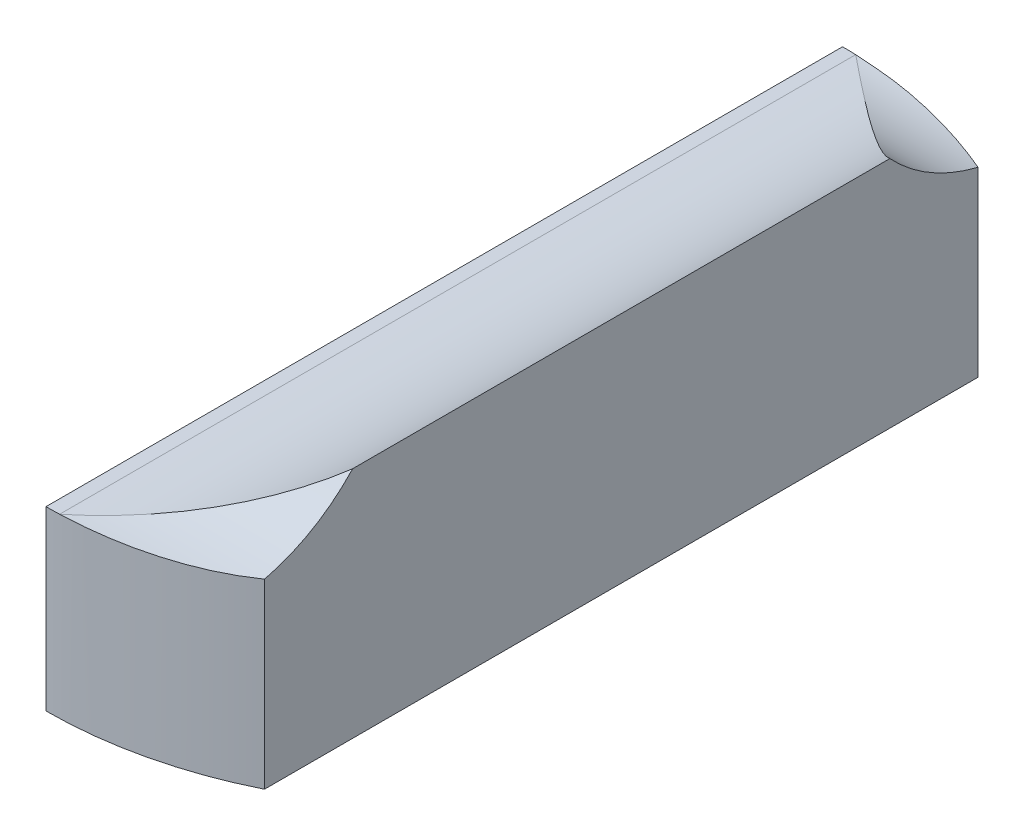
ISO-10303-21;
HEADER;
FILE_DESCRIPTION(('STEP AP214'),'2;1');
FILE_NAME('part.step','',(''),(''),'','','');
FILE_SCHEMA(('AUTOMOTIVE_DESIGN { 1 0 10303 214 1 1 1 1 }'));
ENDSEC;
DATA;
#1=APPLICATION_CONTEXT('core data for automotive mechanical design processes');
#2=APPLICATION_PROTOCOL_DEFINITION('international standard','automotive_design',2000,#1);
#3=PRODUCT_CONTEXT('',#1,'mechanical');
#4=PRODUCT('Part','Part','',(#3));
#5=PRODUCT_RELATED_PRODUCT_CATEGORY('part','',(#4));
#6=PRODUCT_DEFINITION_FORMATION('','',#4);
#7=PRODUCT_DEFINITION_CONTEXT('part definition',#1,'design');
#8=PRODUCT_DEFINITION('design','',#6,#7);
#9=PRODUCT_DEFINITION_SHAPE('','',#8);
#10=(LENGTH_UNIT() NAMED_UNIT(*) SI_UNIT(.MILLI.,.METRE.));
#11=(NAMED_UNIT(*) PLANE_ANGLE_UNIT() SI_UNIT($,.RADIAN.));
#12=(NAMED_UNIT(*) SI_UNIT($,.STERADIAN.) SOLID_ANGLE_UNIT());
#13=UNCERTAINTY_MEASURE_WITH_UNIT(LENGTH_MEASURE(1.E-05),#10,'distance_accuracy_value','');
#14=(GEOMETRIC_REPRESENTATION_CONTEXT(3) GLOBAL_UNCERTAINTY_ASSIGNED_CONTEXT((#13)) GLOBAL_UNIT_ASSIGNED_CONTEXT((#10,
#11,#12)) REPRESENTATION_CONTEXT('',''));
#15=CARTESIAN_POINT('',(0.,0.,0.));
#16=DIRECTION('',(0.,0.,1.));
#17=DIRECTION('',(1.,0.,0.));
#18=AXIS2_PLACEMENT_3D('',#15,#16,#17);
#19=CARTESIAN_POINT('',(0.,0.,0.));
#20=DIRECTION('',(0.,1.,0.));
#21=DIRECTION('',(1.,0.,0.));
#22=AXIS2_PLACEMENT_3D('',#19,#20,#21);
#23=CYLINDRICAL_SURFACE('',#22,28.575);
#24=DIRECTION('',(0.,1.,0.));
#25=VECTOR('',#24,1.);
#26=CARTESIAN_POINT('',(12.7,0.,25.5976683508479));
#27=LINE('',#26,#25);
#28=CARTESIAN_POINT('',(12.7,13.0539279019213,25.5976683508479));
#29=VERTEX_POINT('',#28);
#30=CARTESIAN_POINT('',(12.7,0.,25.5976683508479));
#31=VERTEX_POINT('',#30);
#32=EDGE_CURVE('E109',#29,#31,#27,.F.);
#33=ORIENTED_EDGE('',*,*,#32,.F.);
#34=CARTESIAN_POINT('',(0.962642906827022,12.700010357177,28.5587804997681));
#35=CARTESIAN_POINT('',(1.36077615471735,12.7000623405138,28.5453656936281));
#36=CARTESIAN_POINT('',(1.75862826128871,12.7000777129775,28.523615158628));
#37=CARTESIAN_POINT('',(2.55307900061478,12.7004445435274,28.4635033900954));
#38=CARTESIAN_POINT('',(2.9496776222913,12.7007960045757,28.4251420101689));
#39=CARTESIAN_POINT('',(3.74118367355271,12.7022448100345,28.3318388399094));
#40=CARTESIAN_POINT('',(4.13608981752724,12.7033426454521,28.2768861481122));
#41=CARTESIAN_POINT('',(4.92324947877102,12.7069381444701,28.1505085420081));
#42=CARTESIAN_POINT('',(5.3155030100975,12.7094358006464,28.0790837150642));
#43=CARTESIAN_POINT('',(6.09971504540883,12.7166858056776,27.9192672109259));
#44=CARTESIAN_POINT('',(6.4916472676977,12.7214556291278,27.8307472519799));
#45=CARTESIAN_POINT('',(7.27137942149177,12.7342954373665,27.6372759357328));
#46=CARTESIAN_POINT('',(7.65917937835118,12.7423654018945,27.5323246793108));
#47=CARTESIAN_POINT('',(8.42975641138034,12.7630247665727,27.3062442771493));
#48=CARTESIAN_POINT('',(8.8125354073083,12.775612383907,27.1851215250436));
#49=CARTESIAN_POINT('',(9.57240197152831,12.8067151020722,26.926952705874));
#50=CARTESIAN_POINT('',(9.94948991381911,12.8252298116008,26.7899076903666));
#51=CARTESIAN_POINT('',(10.8728927614276,12.88022897177,26.4321390510183));
#52=CARTESIAN_POINT('',(11.4154826589438,12.9210691874319,26.2023506985232));
#53=CARTESIAN_POINT('',(12.4837500300381,13.024700133787,25.7105492096721));
#54=CARTESIAN_POINT('',(13.0094275076119,13.0874908592944,25.4485360809295));
#55=CARTESIAN_POINT('',(14.0386470887018,13.2413188739397,24.8955218155012));
#56=CARTESIAN_POINT('',(14.5422624233341,13.332253103732,24.6046290316585));
#57=CARTESIAN_POINT('',(15.5253033043412,13.5496409178739,23.9964408281848));
#58=CARTESIAN_POINT('',(16.0047377492519,13.6760813218248,23.6791552366417));
#59=CARTESIAN_POINT('',(16.800254791929,13.9292795846889,23.1180863947747));
#60=CARTESIAN_POINT('',(17.123479173042,14.0453697569777,22.8795842085311));
#61=CARTESIAN_POINT('',(17.7534814150312,14.3020869374188,22.3942506215131));
#62=CARTESIAN_POINT('',(18.0602635179013,14.442707576658,22.1474213960954));
#63=CARTESIAN_POINT('',(18.6552298779792,14.75098919158,21.6486405813578));
#64=CARTESIAN_POINT('',(18.9434257676909,14.9186330198069,21.39669232832));
#65=CARTESIAN_POINT('',(19.4993082033762,15.2832535278009,20.8913521389599));
#66=CARTESIAN_POINT('',(19.7669984562148,15.4802248869015,20.6379604725079));
#67=CARTESIAN_POINT('',(20.2341271811735,15.8672649280327,20.1791498346762));
#68=CARTESIAN_POINT('',(20.4372307469284,16.0523162472183,19.9732236591284));
#69=CARTESIAN_POINT('',(20.8271119044121,16.4437967724493,19.5663328075717));
#70=CARTESIAN_POINT('',(21.0138928933059,16.6502215104805,19.3653671054332));
#71=CARTESIAN_POINT('',(21.3701713398591,17.0844581875766,18.9714767796639));
#72=CARTESIAN_POINT('',(21.5396731307898,17.3122647368571,18.778550147209));
#73=CARTESIAN_POINT('',(21.8606787701723,17.7888329775473,18.4038644446777));
#74=CARTESIAN_POINT('',(22.0121823840227,18.0375949420331,18.2221055201843));
#75=CARTESIAN_POINT('',(22.2974382732527,18.5565357068221,17.8719385757042));
#76=CARTESIAN_POINT('',(22.4310835821065,18.8268293218901,17.7036132435075));
#77=CARTESIAN_POINT('',(22.6792372799584,19.38600360836,17.3845820896443));
#78=CARTESIAN_POINT('',(22.7937450751443,19.674884856127,17.2338768147488));
#79=CARTESIAN_POINT('',(23.0034597029794,20.2691361993014,16.9529413248224));
#80=CARTESIAN_POINT('',(23.0986674152611,20.5745055424336,16.822710176711));
#81=CARTESIAN_POINT('',(23.2697906029362,21.1992400095342,16.5852020750128));
#82=CARTESIAN_POINT('',(23.3457083799338,21.518603458441,16.4779223831843));
#83=CARTESIAN_POINT('',(23.4701116512248,22.1280288875913,16.3001450747159));
#84=CARTESIAN_POINT('',(23.5208356826167,22.4167889086254,16.2267309961218));
#85=CARTESIAN_POINT('',(23.6076984469343,23.0008228755959,16.100096420655));
#86=CARTESIAN_POINT('',(23.6438389598952,23.2960960219103,16.0468734593424));
#87=CARTESIAN_POINT('',(23.7016972573092,23.8916760012838,15.9612926922762));
#88=CARTESIAN_POINT('',(23.7233869803638,24.1919914737936,15.9289754860677));
#89=CARTESIAN_POINT('',(23.7450719580584,24.6440955572715,15.8966136679713));
#90=CARTESIAN_POINT('',(23.7504920138431,24.795104241373,15.8885120518039));
#91=CARTESIAN_POINT('',(23.7577175691802,25.0974022832643,15.8777046290734));
#92=CARTESIAN_POINT('',(23.7595230358135,25.2486916435978,15.8749988716518));
#93=CARTESIAN_POINT('',(23.7595244060145,25.4,15.875));
#94=B_SPLINE_CURVE_WITH_KNOTS('',3,(#34,#35,#36,#37,#38,#39,#40,#41,#42,#43,#44,#45,#46,#47,#48,
#49,#50,#51,#52,#53,#54,#55,#56,#57,#58,#59,#60,#61,#62,#63,#64,#65,#66,#67,#68,#69,#70,#71,#72,
#73,#74,#75,#76,#77,#78,#79,#80,#81,#82,#83,#84,#85,#86,#87,#88,#89,#90,#91,#92,#93),
.UNSPECIFIED.,.F.,.F.,(4,2,2,2,2,2,2,2,2,2,2,2,2,2,2,2,2,2,2,2,2,2,2,2,2,2,2,2,2,4),(0.,
1.19499017098555,2.38999087382109,3.58577847726653,4.78155973878477,5.98668965456981,
7.19181217181565,8.39645962969053,9.60102757401706,11.3715014476631,13.1419749030226,
14.9060402345202,16.6694515834793,17.9228644895058,19.1759524514992,20.4282483792196,
21.6803173888097,22.709415177226,23.7382982701966,24.7669227021674,25.7955605405169,
26.830107096135,27.8646857464337,28.8992172335378,29.9336252261262,30.8392539807823,
31.7447721627436,32.6520436478983,33.1058917422523,33.5597439699006),.UNSPECIFIED.);
#95=CARTESIAN_POINT('',(0.962642846214586,12.7000054003863,28.5587786952444));
#96=VERTEX_POINT('',#95);
#97=EDGE_CURVE('E118',#96,#29,#94,.T.);
#98=ORIENTED_EDGE('',*,*,#97,.F.);
#99=CARTESIAN_POINT('',(0.,12.7,0.));
#100=DIRECTION('',(0.,1.,0.));
#101=DIRECTION('',(0.,0.,1.));
#102=AXIS2_PLACEMENT_3D('',#99,#100,#101);
#103=CIRCLE('',#102,28.575);
#104=CARTESIAN_POINT('',(0.,12.7,28.575));
#105=VERTEX_POINT('',#104);
#106=EDGE_CURVE('E130',#105,#96,#103,.T.);
#107=ORIENTED_EDGE('',*,*,#106,.F.);
#108=DIRECTION('',(0.,1.,0.));
#109=VECTOR('',#108,1.);
#110=CARTESIAN_POINT('',(0.,0.,28.575));
#111=LINE('',#110,#109);
#112=CARTESIAN_POINT('',(0.,0.,28.575));
#113=VERTEX_POINT('',#112);
#114=EDGE_CURVE('E314',#105,#113,#111,.F.);
#115=ORIENTED_EDGE('',*,*,#114,.T.);
#116=CARTESIAN_POINT('',(0.,0.,0.));
#117=DIRECTION('',(0.,1.,0.));
#118=DIRECTION('',(0.,0.,1.));
#119=AXIS2_PLACEMENT_3D('',#116,#117,#118);
#120=CIRCLE('',#119,28.575);
#121=EDGE_CURVE('E122',#113,#31,#120,.T.);
#122=ORIENTED_EDGE('',*,*,#121,.T.);
#123=EDGE_LOOP('',(#33,#98,#107,#115,#122));
#124=FACE_BOUND('',#123,.T.);
#125=ADVANCED_FACE('F52',(#124),#23,.T.);
#126=DIRECTION('',(0.,1.,0.));
#127=VECTOR('',#126,1.);
#128=CARTESIAN_POINT('',(12.7,0.,-25.5976683508479));
#129=LINE('',#128,#127);
#130=CARTESIAN_POINT('',(12.7,0.,-25.5976683508479));
#131=VERTEX_POINT('',#130);
#132=CARTESIAN_POINT('',(12.7000000000208,13.0539439966948,-25.597729758866));
#133=VERTEX_POINT('',#132);
#134=EDGE_CURVE('E315',#131,#133,#129,.T.);
#135=ORIENTED_EDGE('',*,*,#134,.F.);
#136=CARTESIAN_POINT('',(0.,0.,-28.575));
#137=VERTEX_POINT('',#136);
#138=EDGE_CURVE('E78',#131,#137,#120,.T.);
#139=ORIENTED_EDGE('',*,*,#138,.T.);
#140=DIRECTION('',(0.,1.,0.));
#141=VECTOR('',#140,1.);
#142=CARTESIAN_POINT('',(0.,0.,-28.575));
#143=LINE('',#142,#141);
#144=CARTESIAN_POINT('',(0.,12.7,-28.575));
#145=VERTEX_POINT('',#144);
#146=EDGE_CURVE('E311',#137,#145,#143,.T.);
#147=ORIENTED_EDGE('',*,*,#146,.T.);
#148=CARTESIAN_POINT('',(0.,12.7,0.));
#149=DIRECTION('',(0.,1.,0.));
#150=DIRECTION('',(0.,0.,1.));
#151=AXIS2_PLACEMENT_3D('',#148,#149,#150);
#152=CIRCLE('',#151,28.575);
#153=CARTESIAN_POINT('',(0.962642841908872,12.7000054003817,-28.5587786987607));
#154=VERTEX_POINT('',#153);
#155=EDGE_CURVE('E131',#154,#145,#152,.T.);
#156=ORIENTED_EDGE('',*,*,#155,.F.);
#157=CARTESIAN_POINT('',(12.7000284990376,13.0539016943946,-25.5977770274421));
#158=CARTESIAN_POINT('',(12.4747817982099,13.0269692458689,-25.709480409067));
#159=CARTESIAN_POINT('',(12.2478734745281,13.0023108975366,-25.818368573731));
#160=CARTESIAN_POINT('',(11.7904861424625,12.9570337142994,-26.0305145583321));
#161=CARTESIAN_POINT('',(11.5600009133857,12.9364230367958,-26.1337607117217));
#162=CARTESIAN_POINT('',(11.0954597476254,12.8987833745116,-26.3344574558331));
#163=CARTESIAN_POINT('',(10.8613955848795,12.8817646370443,-26.431890911271));
#164=CARTESIAN_POINT('',(10.3897033296195,12.8508762521566,-26.6208530164049));
#165=CARTESIAN_POINT('',(10.1520653980929,12.8370182359678,-26.7123589967159));
#166=CARTESIAN_POINT('',(9.67077339358949,12.8119223107236,-26.8902179557244));
#167=CARTESIAN_POINT('',(9.42708215104546,12.800725645792,-26.9764761005317));
#168=CARTESIAN_POINT('',(8.9437783786336,12.7810338985966,-27.1403154846449));
#169=CARTESIAN_POINT('',(8.70422509434498,12.7724760070961,-27.2180642837316));
#170=CARTESIAN_POINT('',(8.22107885174019,12.7572554254476,-27.3680467011164));
#171=CARTESIAN_POINT('',(7.97746886891291,12.7506096494202,-27.4402271974456));
#172=CARTESIAN_POINT('',(7.48861830677348,12.7389993123294,-27.5780820444085));
#173=CARTESIAN_POINT('',(7.24337944295037,12.7340332028319,-27.6437623476355));
#174=CARTESIAN_POINT('',(6.75127987008959,12.7254728261951,-27.7686055542338));
#175=CARTESIAN_POINT('',(6.50441951036684,12.7218782728461,-27.8277698155064));
#176=CARTESIAN_POINT('',(6.00906559310881,12.715785542748,-27.9395142787487));
#177=CARTESIAN_POINT('',(5.7605712692757,12.7132879241558,-27.9920911191181));
#178=CARTESIAN_POINT('',(5.38549762533349,12.7101660034936,-28.0663437536325));
#179=CARTESIAN_POINT('',(5.25939615094047,12.709226091803,-28.0904434129543));
#180=CARTESIAN_POINT('',(5.01050872965119,12.7075658466626,-28.1361125168846));
#181=CARTESIAN_POINT('',(4.88773259117804,12.7068399397365,-28.1577350436421));
#182=CARTESIAN_POINT('',(4.51512873724559,12.7048829596363,-28.220351785296));
#183=CARTESIAN_POINT('',(4.26478873621659,12.7039024478259,-28.2583399775375));
#184=CARTESIAN_POINT('',(3.76114582506953,12.702377617172,-28.3268698691401));
#185=CARTESIAN_POINT('',(3.50783488562613,12.701836685483,-28.3573525060542));
#186=CARTESIAN_POINT('',(3.18973464436205,12.7013338711028,-28.3908204884213));
#187=CARTESIAN_POINT('',(3.12530789041933,12.7012410888294,-28.3973520703851));
#188=CARTESIAN_POINT('',(2.91777556535275,12.7009689401115,-28.4174929917689));
#189=CARTESIAN_POINT('',(2.77456469350872,12.7008220204437,-28.4300167084153));
#190=CARTESIAN_POINT('',(2.38589547964567,12.7004858720882,-28.4620921302199));
#191=CARTESIAN_POINT('',(2.14032982119313,12.7003411519821,-28.4802890606143));
#192=CARTESIAN_POINT('',(1.74879001562498,12.7001739287355,-28.5077820029786));
#193=CARTESIAN_POINT('',(1.60285746229092,12.7001256606994,-28.5176924147875));
#194=CARTESIAN_POINT('',(1.29555270993374,12.7000494013902,-28.5379980477656));
#195=CARTESIAN_POINT('',(1.13417658800302,12.7000240879271,-28.5483340383686));
#196=CARTESIAN_POINT('',(0.972785683820233,12.7000108007634,-28.5584368096952));
#197=B_SPLINE_CURVE_WITH_KNOTS('',3,(#157,#158,#159,#160,#161,#162,#163,#164,#165,#166,#167,
#168,#169,#170,#171,#172,#173,#174,#175,#176,#177,#178,#179,#180,#181,#182,#183,#184,#185,#186,
#187,#188,#189,#190,#191,#192,#193,#194,#195,#196),.UNSPECIFIED.,.F.,.F.,(4,2,2,2,2,2,2,2,2,2,2,
2,2,2,2,2,2,2,2,4),(0.,0.758545960948696,1.5186053001464,2.2808045197662,3.04576488159419,
3.82190291646015,4.57781116189232,5.34021372165884,6.10191151752728,6.86345027890783,
7.62537608880005,8.01052690380459,8.3845172734778,9.14400760366837,9.90929607664855,
10.1035658465431,10.534820179719,11.27352147083,11.7123271614336,12.1974466777529),.UNSPECIFIED.);
#198=EDGE_CURVE('E139',#133,#154,#197,.T.);
#199=ORIENTED_EDGE('',*,*,#198,.F.);
#200=EDGE_LOOP('',(#135,#139,#147,#156,#199));
#201=FACE_BOUND('',#200,.T.);
#202=ADVANCED_FACE('F155',(#201),#23,.T.);
#203=CARTESIAN_POINT('',(-20.0025,12.7,-31.75));
#204=DIRECTION('',(0.,-1.,0.));
#205=DIRECTION('',(1.,0.,0.));
#206=AXIS2_PLACEMENT_3D('',#203,#204,#205);
#207=PLANE('',#206);
#208=DIRECTION('',(0.,0.,-1.));
#209=VECTOR('',#208,1.);
#210=CARTESIAN_POINT('',(0.,12.7,-31.75));
#211=LINE('',#210,#209);
#212=EDGE_CURVE('E172',#105,#145,#211,.T.);
#213=ORIENTED_EDGE('',*,*,#212,.F.);
#214=ORIENTED_EDGE('',*,*,#106,.T.);
#215=CARTESIAN_POINT('',(0.952500000000002,12.7,28.5591205878262));
#216=DIRECTION('',(0.,0.,-1.));
#217=VECTOR('',#216,1.);
#218=LINE('',#215,#217);
#219=EDGE_CURVE('E303',#96,#154,#218,.T.);
#220=ORIENTED_EDGE('',*,*,#219,.T.);
#221=ORIENTED_EDGE('',*,*,#155,.T.);
#222=EDGE_LOOP('',(#213,#214,#220,#221));
#223=FACE_BOUND('',#222,.T.);
#224=ADVANCED_FACE('F164',(#223),#207,.F.);
#225=CARTESIAN_POINT('',(0.,0.,0.));
#226=DIRECTION('',(0.,1.,0.));
#227=DIRECTION('',(1.,0.,0.));
#228=AXIS2_PLACEMENT_3D('',#225,#226,#227);
#229=PLANE('',#228);
#230=ORIENTED_EDGE('',*,*,#138,.F.);
#231=DIRECTION('',(0.,0.,1.));
#232=VECTOR('',#231,1.);
#233=CARTESIAN_POINT('',(12.7,0.,0.));
#234=LINE('',#233,#232);
#235=EDGE_CURVE('E317',#131,#31,#234,.T.);
#236=ORIENTED_EDGE('',*,*,#235,.T.);
#237=ORIENTED_EDGE('',*,*,#121,.F.);
#238=DIRECTION('',(0.,0.,1.));
#239=VECTOR('',#238,1.);
#240=CARTESIAN_POINT('',(0.,0.,0.));
#241=LINE('',#240,#239);
#242=EDGE_CURVE('E63',#137,#113,#241,.T.);
#243=ORIENTED_EDGE('',*,*,#242,.F.);
#244=EDGE_LOOP('',(#230,#236,#237,#243));
#245=FACE_BOUND('',#244,.T.);
#246=ADVANCED_FACE('F329',(#245),#229,.F.);
#247=CARTESIAN_POINT('',(0.9525,31.75,103.07574));
#248=DIRECTION('',(0.,0.,-1.));
#249=DIRECTION('',(1.,0.,0.));
#250=AXIS2_PLACEMENT_3D('',#247,#248,#249);
#251=CYLINDRICAL_SURFACE('',#250,19.05);
#252=CARTESIAN_POINT('',(12.6996846467272,16.7537714567145,19.2727028655673));
#253=CARTESIAN_POINT('',(12.3836807090729,16.5060880044344,19.5029369841748));
#254=CARTESIAN_POINT('',(12.0631276498044,16.2708258106197,19.7400198848824));
#255=CARTESIAN_POINT('',(11.5639836527342,15.9277500081034,20.1134426401017));
#256=CARTESIAN_POINT('',(11.3882585010004,15.8112892113761,20.2456971878909));
#257=CARTESIAN_POINT('',(11.0835985110636,15.616611733751,20.4761521958765));
#258=CARTESIAN_POINT('',(10.9551816896896,15.5367351284662,20.5736411998489));
#259=CARTESIAN_POINT('',(10.544711435346,15.2881600329862,20.8863219643607));
#260=CARTESIAN_POINT('',(10.2606624135166,15.1261974210174,21.1042922727303));
#261=CARTESIAN_POINT('',(9.67136200811487,14.8096181686767,21.5596431151327));
#262=CARTESIAN_POINT('',(9.36585928181223,14.6560216488287,21.7974044990257));
#263=CARTESIAN_POINT('',(8.73360544205284,14.35875281632,22.2925725266953));
#264=CARTESIAN_POINT('',(8.406631720637,14.2161370387246,22.5503286702167));
#265=CARTESIAN_POINT('',(7.73137426857963,13.9435887244313,23.0854091579467));
#266=CARTESIAN_POINT('',(7.38289096071191,13.8147523392913,23.3630399199153));
#267=CARTESIAN_POINT('',(6.75454823365464,13.6028973778014,23.8657895632651));
#268=CARTESIAN_POINT('',(6.47528433811045,13.5159022423919,24.0899907457999));
#269=CARTESIAN_POINT('',(5.89096212604077,13.3487190500375,24.5595346415406));
#270=CARTESIAN_POINT('',(5.58571374597999,13.2697228783621,24.8050664431115));
#271=CARTESIAN_POINT('',(4.98598228259901,13.1300875769923,25.2886695899489));
#272=CARTESIAN_POINT('',(4.69156143805803,13.0688366701815,25.5266425323838));
#273=CARTESIAN_POINT('',(4.05983696140684,12.9526926843272,26.0386813635427));
#274=CARTESIAN_POINT('',(3.72239380593353,12.8999451257092,26.3130638116321));
#275=CARTESIAN_POINT('',(3.00458232470225,12.8073045962538,26.8980170193272));
#276=CARTESIAN_POINT('',(2.62410425009589,12.7698321382172,27.2088371140475));
#277=CARTESIAN_POINT('',(1.82017170778739,12.7150592317748,27.8659559841579));
#278=CARTESIAN_POINT('',(1.39662621944544,12.7004537204084,28.2123701556859));
#279=CARTESIAN_POINT('',(0.97278571827359,12.7000108008001,28.5584367815646));
#280=B_SPLINE_CURVE_WITH_KNOTS('',3,(#252,#253,#254,#255,#256,#257,#258,#259,#260,#261,#262,
#263,#264,#265,#266,#267,#268,#269,#270,#271,#272,#273,#274,#275,#276,#277,#278,#279),
.UNSPECIFIED.,.F.,.F.,(4,2,2,2,2,2,2,2,2,2,2,2,2,4),(0.,1.38801973869458,2.13448506083237,
2.67424271728665,3.85267234325182,5.10164466445768,6.42143538823047,7.81227794970193,
8.91765335569892,10.1162025653245,11.2664217262296,12.5803419315289,14.0579723935703,
15.6993161377353),.UNSPECIFIED.);
#281=CARTESIAN_POINT('',(12.6999999344327,16.7538578159521,19.2727645156213));
#282=VERTEX_POINT('',#281);
#283=EDGE_CURVE('E126',#282,#96,#280,.T.);
#284=ORIENTED_EDGE('',*,*,#283,.F.);
#285=DIRECTION('',(0.,0.,-1.));
#286=VECTOR('',#285,1.);
#287=CARTESIAN_POINT('',(12.7,16.7533755881532,103.07574));
#288=LINE('',#287,#286);
#289=CARTESIAN_POINT('',(12.6999998776071,16.7536943821638,-19.2730440936521));
#290=VERTEX_POINT('',#289);
#291=EDGE_CURVE('E71',#282,#290,#288,.T.);
#292=ORIENTED_EDGE('',*,*,#291,.T.);
#293=CARTESIAN_POINT('',(12.7003087582626,16.7536174568902,-19.2733851829879));
#294=CARTESIAN_POINT('',(12.3837117700791,16.5056121379206,-19.503794350074));
#295=CARTESIAN_POINT('',(12.0624003288813,16.2700696708052,-19.7408759475539));
#296=CARTESIAN_POINT('',(11.5629844671348,15.9270802145532,-20.114021021097));
#297=CARTESIAN_POINT('',(11.3876724756388,15.8109453131508,-20.2458654915789));
#298=CARTESIAN_POINT('',(11.0827744491229,15.6160815796705,-20.4765985414318));
#299=CARTESIAN_POINT('',(10.953656770786,15.535736998378,-20.5747470925138));
#300=CARTESIAN_POINT('',(10.5426796129005,15.2867319929454,-20.8884134272698));
#301=CARTESIAN_POINT('',(10.2589416272464,15.1247792535024,-21.1068373666605));
#302=CARTESIAN_POINT('',(9.6702235802247,14.8082750609913,-21.5629041829372));
#303=CARTESIAN_POINT('',(9.36498555059316,14.6547403817323,-21.8009165359319));
#304=CARTESIAN_POINT('',(8.73302668118058,14.3576281849587,-22.2962155582069));
#305=CARTESIAN_POINT('',(8.40606763829824,14.2151058401419,-22.5538307399131));
#306=CARTESIAN_POINT('',(7.73069299274227,13.9427471193777,-23.0884229897588));
#307=CARTESIAN_POINT('',(7.3820697248786,13.8140064533683,-23.3656958720342));
#308=CARTESIAN_POINT('',(6.75386035409544,13.6024761354486,-23.86726855222));
#309=CARTESIAN_POINT('',(6.47489578110171,13.515688512735,-24.0906742076801));
#310=CARTESIAN_POINT('',(5.89208446122224,13.3488424499191,-24.5596943402353));
#311=CARTESIAN_POINT('',(5.58812486891145,13.2699702156023,-24.8055918115737));
#312=CARTESIAN_POINT('',(4.99059892890007,13.1304789329406,-25.2899514631784));
#313=CARTESIAN_POINT('',(4.6970976612733,13.0692607468513,-25.528322478541));
#314=CARTESIAN_POINT('',(4.06633072358958,12.9530951967466,-26.0407524735809));
#315=CARTESIAN_POINT('',(3.72883410456318,12.9003114898343,-26.3150197211582));
#316=CARTESIAN_POINT('',(3.00999694128152,12.8075476959319,-26.8993089938853));
#317=CARTESIAN_POINT('',(2.62847401072353,12.770008603874,-27.2094949278093));
#318=CARTESIAN_POINT('',(1.82216630010023,12.7151055694219,-27.865697874335));
#319=CARTESIAN_POINT('',(1.39730503412923,12.7004605950067,-28.2118505365354));
#320=CARTESIAN_POINT('',(0.972785683816897,12.7000108007634,-28.5584368096954));
#321=B_SPLINE_CURVE_WITH_KNOTS('',3,(#293,#294,#295,#296,#297,#298,#299,#300,#301,#302,#303,
#304,#305,#306,#307,#308,#309,#310,#311,#312,#313,#314,#315,#316,#317,#318,#319,#320),
.UNSPECIFIED.,.F.,.F.,(4,2,2,2,2,2,2,2,2,2,2,2,2,4),(0.,1.39001523399492,2.13449504336376,
2.67744757256695,3.8559459443808,5.10469937027963,6.4241203530017,7.81455831400332,
8.91765533282693,10.1138559738285,11.2626874816288,12.5765292056253,14.0553984377756,
15.6993036963012),.UNSPECIFIED.);
#322=EDGE_CURVE('E298',#290,#154,#321,.T.);
#323=ORIENTED_EDGE('',*,*,#322,.T.);
#324=ORIENTED_EDGE('',*,*,#219,.F.);
#325=EDGE_LOOP('',(#284,#292,#323,#324));
#326=FACE_BOUND('',#325,.T.);
#327=ADVANCED_FACE('F54',(#326),#251,.F.);
#328=CARTESIAN_POINT('',(-31.75,25.4,-28.575));
#329=DIRECTION('',(-1.,0.,0.));
#330=DIRECTION('',(0.,0.,1.));
#331=AXIS2_PLACEMENT_3D('',#328,#329,#330);
#332=CYLINDRICAL_SURFACE('',#331,12.7);
#333=ORIENTED_EDGE('',*,*,#322,.F.);
#334=CARTESIAN_POINT('',(12.7,25.4,-28.575));
#335=DIRECTION('',(-1.,0.,0.));
#336=DIRECTION('',(0.,0.,1.));
#337=AXIS2_PLACEMENT_3D('',#334,#335,#336);
#338=CIRCLE('',#337,12.7);
#339=EDGE_CURVE('E123',#290,#133,#338,.F.);
#340=ORIENTED_EDGE('',*,*,#339,.T.);
#341=ORIENTED_EDGE('',*,*,#198,.T.);
#342=EDGE_LOOP('',(#333,#340,#341));
#343=FACE_BOUND('',#342,.T.);
#344=ADVANCED_FACE('F163',(#343),#332,.F.);
#345=CARTESIAN_POINT('',(-31.75,25.4,28.575));
#346=DIRECTION('',(1.,0.,0.));
#347=DIRECTION('',(0.,0.,-1.));
#348=AXIS2_PLACEMENT_3D('',#345,#346,#347);
#349=CYLINDRICAL_SURFACE('',#348,12.7);
#350=ORIENTED_EDGE('',*,*,#97,.T.);
#351=CARTESIAN_POINT('',(12.7,25.4,28.575));
#352=DIRECTION('',(-1.,0.,0.));
#353=DIRECTION('',(0.,0.,1.));
#354=AXIS2_PLACEMENT_3D('',#351,#352,#353);
#355=CIRCLE('',#354,12.7);
#356=EDGE_CURVE('E13',#29,#282,#355,.F.);
#357=ORIENTED_EDGE('',*,*,#356,.T.);
#358=ORIENTED_EDGE('',*,*,#283,.T.);
#359=EDGE_LOOP('',(#350,#357,#358));
#360=FACE_BOUND('',#359,.T.);
#361=ADVANCED_FACE('F125',(#360),#349,.F.);
#362=CARTESIAN_POINT('',(0.,0.,0.));
#363=DIRECTION('',(-1.,0.,0.));
#364=DIRECTION('',(0.,0.,1.));
#365=AXIS2_PLACEMENT_3D('',#362,#363,#364);
#366=PLANE('',#365);
#367=ORIENTED_EDGE('',*,*,#212,.T.);
#368=ORIENTED_EDGE('',*,*,#146,.F.);
#369=ORIENTED_EDGE('',*,*,#242,.T.);
#370=ORIENTED_EDGE('',*,*,#114,.F.);
#371=EDGE_LOOP('',(#367,#368,#369,#370));
#372=FACE_BOUND('',#371,.T.);
#373=ADVANCED_FACE('F162',(#372),#366,.T.);
#374=CARTESIAN_POINT('',(12.7,0.,0.));
#375=DIRECTION('',(-1.,0.,0.));
#376=DIRECTION('',(0.,0.,1.));
#377=AXIS2_PLACEMENT_3D('',#374,#375,#376);
#378=PLANE('',#377);
#379=ORIENTED_EDGE('',*,*,#134,.T.);
#380=ORIENTED_EDGE('',*,*,#339,.F.);
#381=ORIENTED_EDGE('',*,*,#291,.F.);
#382=ORIENTED_EDGE('',*,*,#356,.F.);
#383=ORIENTED_EDGE('',*,*,#32,.T.);
#384=ORIENTED_EDGE('',*,*,#235,.F.);
#385=EDGE_LOOP('',(#379,#380,#381,#382,#383,#384));
#386=FACE_BOUND('',#385,.T.);
#387=ADVANCED_FACE('F108',(#386),#378,.F.);
#388=CLOSED_SHELL('',(#125,#202,#224,#246,#327,#344,#361,#373,#387));
#389=MANIFOLD_SOLID_BREP('B2',#388);
#390=ADVANCED_BREP_SHAPE_REPRESENTATION('',(#18,#389),#14);
#391=SHAPE_DEFINITION_REPRESENTATION(#9,#390);
ENDSEC;
END-ISO-10303-21;
